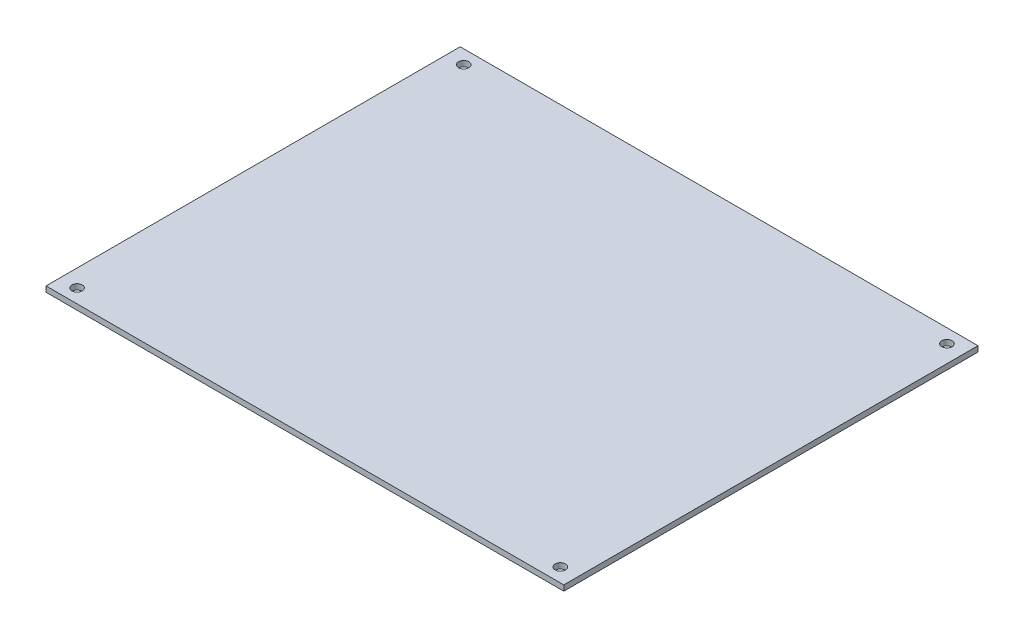
ISO-10303-21;
HEADER;
FILE_DESCRIPTION(('STEP AP214'),'2;1');
FILE_NAME('part.step','',(''),(''),'','','');
FILE_SCHEMA(('AUTOMOTIVE_DESIGN { 1 0 10303 214 1 1 1 1 }'));
ENDSEC;
DATA;
#1=APPLICATION_CONTEXT('core data for automotive mechanical design processes');
#2=APPLICATION_PROTOCOL_DEFINITION('international standard','automotive_design',2000,#1);
#3=PRODUCT_CONTEXT('',#1,'mechanical');
#4=PRODUCT('Part','Part','',(#3));
#5=PRODUCT_RELATED_PRODUCT_CATEGORY('part','',(#4));
#6=PRODUCT_DEFINITION_FORMATION('','',#4);
#7=PRODUCT_DEFINITION_CONTEXT('part definition',#1,'design');
#8=PRODUCT_DEFINITION('design','',#6,#7);
#9=PRODUCT_DEFINITION_SHAPE('','',#8);
#10=(LENGTH_UNIT() NAMED_UNIT(*) SI_UNIT(.MILLI.,.METRE.));
#11=(NAMED_UNIT(*) PLANE_ANGLE_UNIT() SI_UNIT($,.RADIAN.));
#12=(NAMED_UNIT(*) SI_UNIT($,.STERADIAN.) SOLID_ANGLE_UNIT());
#13=UNCERTAINTY_MEASURE_WITH_UNIT(LENGTH_MEASURE(1.E-05),#10,'distance_accuracy_value','');
#14=(GEOMETRIC_REPRESENTATION_CONTEXT(3) GLOBAL_UNCERTAINTY_ASSIGNED_CONTEXT((#13)) GLOBAL_UNIT_ASSIGNED_CONTEXT((#10,
#11,#12)) REPRESENTATION_CONTEXT('',''));
#15=CARTESIAN_POINT('',(0.,0.,0.));
#16=DIRECTION('',(0.,0.,1.));
#17=DIRECTION('',(1.,0.,0.));
#18=AXIS2_PLACEMENT_3D('',#15,#16,#17);
#19=CARTESIAN_POINT('',(0.,1.6,0.));
#20=DIRECTION('',(0.,1.,0.));
#21=DIRECTION('',(0.,0.,1.));
#22=AXIS2_PLACEMENT_3D('',#19,#20,#21);
#23=PLANE('',#22);
#24=CARTESIAN_POINT('',(-70.,1.6,56.));
#25=DIRECTION('',(0.,1.,0.));
#26=DIRECTION('',(0.,0.,-1.));
#27=AXIS2_PLACEMENT_3D('',#24,#25,#26);
#28=CIRCLE('',#27,1.5);
#29=CARTESIAN_POINT('',(-70.,1.6,54.5));
#30=VERTEX_POINT('',#29);
#31=EDGE_CURVE('E123',#30,#30,#28,.T.);
#32=ORIENTED_EDGE('',*,*,#31,.F.);
#33=EDGE_LOOP('',(#32));
#34=FACE_BOUND('',#33,.T.);
#35=CARTESIAN_POINT('',(70.,1.6,-56.));
#36=DIRECTION('',(0.,1.,0.));
#37=DIRECTION('',(0.,0.,1.));
#38=AXIS2_PLACEMENT_3D('',#35,#36,#37);
#39=CIRCLE('',#38,1.5);
#40=CARTESIAN_POINT('',(70.,1.6,-54.5));
#41=VERTEX_POINT('',#40);
#42=EDGE_CURVE('E102',#41,#41,#39,.T.);
#43=ORIENTED_EDGE('',*,*,#42,.F.);
#44=EDGE_LOOP('',(#43));
#45=FACE_BOUND('',#44,.T.);
#46=DIRECTION('',(0.,0.,-1.));
#47=VECTOR('',#46,1.);
#48=CARTESIAN_POINT('',(75.,1.6,-60.));
#49=LINE('',#48,#47);
#50=CARTESIAN_POINT('',(75.,1.6,60.));
#51=VERTEX_POINT('',#50);
#52=CARTESIAN_POINT('',(75.,1.6,-60.));
#53=VERTEX_POINT('',#52);
#54=EDGE_CURVE('E87',#51,#53,#49,.T.);
#55=ORIENTED_EDGE('',*,*,#54,.T.);
#56=DIRECTION('',(-1.,0.,0.));
#57=VECTOR('',#56,1.);
#58=CARTESIAN_POINT('',(-75.,1.6,-60.));
#59=LINE('',#58,#57);
#60=CARTESIAN_POINT('',(-75.,1.6,-60.));
#61=VERTEX_POINT('',#60);
#62=EDGE_CURVE('E82',#53,#61,#59,.T.);
#63=ORIENTED_EDGE('',*,*,#62,.T.);
#64=DIRECTION('',(0.,0.,1.));
#65=VECTOR('',#64,1.);
#66=CARTESIAN_POINT('',(-75.,1.6,-60.));
#67=LINE('',#66,#65);
#68=CARTESIAN_POINT('',(-75.,1.6,60.));
#69=VERTEX_POINT('',#68);
#70=EDGE_CURVE('E85',#61,#69,#67,.T.);
#71=ORIENTED_EDGE('',*,*,#70,.T.);
#72=DIRECTION('',(1.,0.,0.));
#73=VECTOR('',#72,1.);
#74=CARTESIAN_POINT('',(-75.,1.6,60.));
#75=LINE('',#74,#73);
#76=EDGE_CURVE('E52',#69,#51,#75,.T.);
#77=ORIENTED_EDGE('',*,*,#76,.T.);
#78=EDGE_LOOP('',(#55,#63,#71,#77));
#79=FACE_BOUND('',#78,.T.);
#80=CARTESIAN_POINT('',(70.,1.6,56.));
#81=DIRECTION('',(0.,1.,0.));
#82=DIRECTION('',(0.,0.,1.));
#83=AXIS2_PLACEMENT_3D('',#80,#81,#82);
#84=CIRCLE('',#83,1.5);
#85=CARTESIAN_POINT('',(70.,1.6,57.5));
#86=VERTEX_POINT('',#85);
#87=EDGE_CURVE('E117',#86,#86,#84,.T.);
#88=ORIENTED_EDGE('',*,*,#87,.F.);
#89=EDGE_LOOP('',(#88));
#90=FACE_BOUND('',#89,.T.);
#91=CARTESIAN_POINT('',(-70.,1.6,-56.));
#92=DIRECTION('',(0.,1.,0.));
#93=DIRECTION('',(0.,0.,-1.));
#94=AXIS2_PLACEMENT_3D('',#91,#92,#93);
#95=CIRCLE('',#94,1.5);
#96=CARTESIAN_POINT('',(-70.,1.6,-57.5));
#97=VERTEX_POINT('',#96);
#98=EDGE_CURVE('E129',#97,#97,#95,.T.);
#99=ORIENTED_EDGE('',*,*,#98,.F.);
#100=EDGE_LOOP('',(#99));
#101=FACE_BOUND('',#100,.T.);
#102=ADVANCED_FACE('F35',(#34,#45,#79,#90,#101),#23,.T.);
#103=CARTESIAN_POINT('',(0.,0.,0.));
#104=DIRECTION('',(0.,1.,0.));
#105=DIRECTION('',(0.,0.,1.));
#106=AXIS2_PLACEMENT_3D('',#103,#104,#105);
#107=PLANE('',#106);
#108=DIRECTION('',(0.,0.,-1.));
#109=VECTOR('',#108,1.);
#110=CARTESIAN_POINT('',(75.,0.,-60.));
#111=LINE('',#110,#109);
#112=CARTESIAN_POINT('',(75.,0.,60.));
#113=VERTEX_POINT('',#112);
#114=CARTESIAN_POINT('',(75.,0.,-60.));
#115=VERTEX_POINT('',#114);
#116=EDGE_CURVE('E99',#113,#115,#111,.T.);
#117=ORIENTED_EDGE('',*,*,#116,.F.);
#118=DIRECTION('',(1.,0.,0.));
#119=VECTOR('',#118,1.);
#120=CARTESIAN_POINT('',(-75.,0.,60.));
#121=LINE('',#120,#119);
#122=CARTESIAN_POINT('',(-75.,0.,60.));
#123=VERTEX_POINT('',#122);
#124=EDGE_CURVE('E75',#123,#113,#121,.T.);
#125=ORIENTED_EDGE('',*,*,#124,.F.);
#126=DIRECTION('',(0.,0.,1.));
#127=VECTOR('',#126,1.);
#128=CARTESIAN_POINT('',(-75.,0.,-60.));
#129=LINE('',#128,#127);
#130=CARTESIAN_POINT('',(-75.,0.,-60.));
#131=VERTEX_POINT('',#130);
#132=EDGE_CURVE('E69',#131,#123,#129,.T.);
#133=ORIENTED_EDGE('',*,*,#132,.F.);
#134=DIRECTION('',(-1.,0.,0.));
#135=VECTOR('',#134,1.);
#136=CARTESIAN_POINT('',(-75.,0.,-60.));
#137=LINE('',#136,#135);
#138=EDGE_CURVE('E91',#115,#131,#137,.T.);
#139=ORIENTED_EDGE('',*,*,#138,.F.);
#140=EDGE_LOOP('',(#117,#125,#133,#139));
#141=FACE_BOUND('',#140,.T.);
#142=CARTESIAN_POINT('',(70.,0.,-56.));
#143=DIRECTION('',(0.,1.,0.));
#144=DIRECTION('',(0.,0.,1.));
#145=AXIS2_PLACEMENT_3D('',#142,#143,#144);
#146=CIRCLE('',#145,1.5);
#147=CARTESIAN_POINT('',(70.,0.,-54.5));
#148=VERTEX_POINT('',#147);
#149=EDGE_CURVE('E114',#148,#148,#146,.T.);
#150=ORIENTED_EDGE('',*,*,#149,.T.);
#151=EDGE_LOOP('',(#150));
#152=FACE_BOUND('',#151,.T.);
#153=CARTESIAN_POINT('',(70.,0.,56.));
#154=DIRECTION('',(0.,1.,0.));
#155=DIRECTION('',(0.,0.,1.));
#156=AXIS2_PLACEMENT_3D('',#153,#154,#155);
#157=CIRCLE('',#156,1.5);
#158=CARTESIAN_POINT('',(70.,0.,57.5));
#159=VERTEX_POINT('',#158);
#160=EDGE_CURVE('E120',#159,#159,#157,.T.);
#161=ORIENTED_EDGE('',*,*,#160,.T.);
#162=EDGE_LOOP('',(#161));
#163=FACE_BOUND('',#162,.T.);
#164=CARTESIAN_POINT('',(-70.,0.,56.));
#165=DIRECTION('',(0.,1.,0.));
#166=DIRECTION('',(0.,0.,-1.));
#167=AXIS2_PLACEMENT_3D('',#164,#165,#166);
#168=CIRCLE('',#167,1.5);
#169=CARTESIAN_POINT('',(-70.,0.,54.5));
#170=VERTEX_POINT('',#169);
#171=EDGE_CURVE('E126',#170,#170,#168,.T.);
#172=ORIENTED_EDGE('',*,*,#171,.T.);
#173=EDGE_LOOP('',(#172));
#174=FACE_BOUND('',#173,.T.);
#175=CARTESIAN_POINT('',(-70.,0.,-56.));
#176=DIRECTION('',(0.,1.,0.));
#177=DIRECTION('',(0.,0.,-1.));
#178=AXIS2_PLACEMENT_3D('',#175,#176,#177);
#179=CIRCLE('',#178,1.5);
#180=CARTESIAN_POINT('',(-70.,0.,-57.5));
#181=VERTEX_POINT('',#180);
#182=EDGE_CURVE('E132',#181,#181,#179,.T.);
#183=ORIENTED_EDGE('',*,*,#182,.T.);
#184=EDGE_LOOP('',(#183));
#185=FACE_BOUND('',#184,.T.);
#186=ADVANCED_FACE('F110',(#141,#152,#163,#174,#185),#107,.F.);
#187=CARTESIAN_POINT('',(75.,1.6,-60.));
#188=DIRECTION('',(-1.,0.,0.));
#189=DIRECTION('',(0.,0.,1.));
#190=AXIS2_PLACEMENT_3D('',#187,#188,#189);
#191=PLANE('',#190);
#192=ORIENTED_EDGE('',*,*,#116,.T.);
#193=DIRECTION('',(0.,-1.,0.));
#194=VECTOR('',#193,1.);
#195=CARTESIAN_POINT('',(75.,1.6,-60.));
#196=LINE('',#195,#194);
#197=EDGE_CURVE('E11',#53,#115,#196,.T.);
#198=ORIENTED_EDGE('',*,*,#197,.F.);
#199=ORIENTED_EDGE('',*,*,#54,.F.);
#200=DIRECTION('',(0.,-1.,0.));
#201=VECTOR('',#200,1.);
#202=CARTESIAN_POINT('',(75.,1.6,60.));
#203=LINE('',#202,#201);
#204=EDGE_CURVE('E95',#51,#113,#203,.T.);
#205=ORIENTED_EDGE('',*,*,#204,.T.);
#206=EDGE_LOOP('',(#192,#198,#199,#205));
#207=FACE_BOUND('',#206,.T.);
#208=ADVANCED_FACE('F37',(#207),#191,.F.);
#209=CARTESIAN_POINT('',(-75.,1.6,-60.));
#210=DIRECTION('',(0.,0.,1.));
#211=DIRECTION('',(1.,0.,0.));
#212=AXIS2_PLACEMENT_3D('',#209,#210,#211);
#213=PLANE('',#212);
#214=ORIENTED_EDGE('',*,*,#138,.T.);
#215=DIRECTION('',(0.,-1.,0.));
#216=VECTOR('',#215,1.);
#217=CARTESIAN_POINT('',(-75.,1.6,-60.));
#218=LINE('',#217,#216);
#219=EDGE_CURVE('E44',#61,#131,#218,.T.);
#220=ORIENTED_EDGE('',*,*,#219,.F.);
#221=ORIENTED_EDGE('',*,*,#62,.F.);
#222=ORIENTED_EDGE('',*,*,#197,.T.);
#223=EDGE_LOOP('',(#214,#220,#221,#222));
#224=FACE_BOUND('',#223,.T.);
#225=ADVANCED_FACE('F90',(#224),#213,.F.);
#226=CARTESIAN_POINT('',(-75.,1.6,-60.));
#227=DIRECTION('',(1.,0.,0.));
#228=DIRECTION('',(0.,0.,-1.));
#229=AXIS2_PLACEMENT_3D('',#226,#227,#228);
#230=PLANE('',#229);
#231=ORIENTED_EDGE('',*,*,#132,.T.);
#232=DIRECTION('',(0.,-1.,0.));
#233=VECTOR('',#232,1.);
#234=CARTESIAN_POINT('',(-75.,1.6,60.));
#235=LINE('',#234,#233);
#236=EDGE_CURVE('E92',#69,#123,#235,.T.);
#237=ORIENTED_EDGE('',*,*,#236,.F.);
#238=ORIENTED_EDGE('',*,*,#70,.F.);
#239=ORIENTED_EDGE('',*,*,#219,.T.);
#240=EDGE_LOOP('',(#231,#237,#238,#239));
#241=FACE_BOUND('',#240,.T.);
#242=ADVANCED_FACE('F93',(#241),#230,.F.);
#243=CARTESIAN_POINT('',(-75.,1.6,60.));
#244=DIRECTION('',(0.,0.,-1.));
#245=DIRECTION('',(-1.,0.,0.));
#246=AXIS2_PLACEMENT_3D('',#243,#244,#245);
#247=PLANE('',#246);
#248=ORIENTED_EDGE('',*,*,#124,.T.);
#249=ORIENTED_EDGE('',*,*,#204,.F.);
#250=ORIENTED_EDGE('',*,*,#76,.F.);
#251=ORIENTED_EDGE('',*,*,#236,.T.);
#252=EDGE_LOOP('',(#248,#249,#250,#251));
#253=FACE_BOUND('',#252,.T.);
#254=ADVANCED_FACE('F107',(#253),#247,.F.);
#255=CARTESIAN_POINT('',(70.,1.6,-56.));
#256=DIRECTION('',(0.,-1.,0.));
#257=DIRECTION('',(0.,0.,-1.));
#258=AXIS2_PLACEMENT_3D('',#255,#256,#257);
#259=CYLINDRICAL_SURFACE('',#258,1.5);
#260=ORIENTED_EDGE('',*,*,#42,.T.);
#261=EDGE_LOOP('',(#260));
#262=FACE_BOUND('',#261,.T.);
#263=ORIENTED_EDGE('',*,*,#149,.F.);
#264=EDGE_LOOP('',(#263));
#265=FACE_BOUND('',#264,.T.);
#266=ADVANCED_FACE('F151',(#262,#265),#259,.F.);
#267=CARTESIAN_POINT('',(70.,1.6,56.));
#268=DIRECTION('',(0.,-1.,0.));
#269=DIRECTION('',(0.,0.,-1.));
#270=AXIS2_PLACEMENT_3D('',#267,#268,#269);
#271=CYLINDRICAL_SURFACE('',#270,1.5);
#272=ORIENTED_EDGE('',*,*,#87,.T.);
#273=EDGE_LOOP('',(#272));
#274=FACE_BOUND('',#273,.T.);
#275=ORIENTED_EDGE('',*,*,#160,.F.);
#276=EDGE_LOOP('',(#275));
#277=FACE_BOUND('',#276,.T.);
#278=ADVANCED_FACE('F197',(#274,#277),#271,.F.);
#279=CARTESIAN_POINT('',(-70.,1.6,56.));
#280=DIRECTION('',(0.,-1.,0.));
#281=DIRECTION('',(0.,0.,-1.));
#282=AXIS2_PLACEMENT_3D('',#279,#280,#281);
#283=CYLINDRICAL_SURFACE('',#282,1.5);
#284=ORIENTED_EDGE('',*,*,#31,.T.);
#285=EDGE_LOOP('',(#284));
#286=FACE_BOUND('',#285,.T.);
#287=ORIENTED_EDGE('',*,*,#171,.F.);
#288=EDGE_LOOP('',(#287));
#289=FACE_BOUND('',#288,.T.);
#290=ADVANCED_FACE('F205',(#286,#289),#283,.F.);
#291=CARTESIAN_POINT('',(-70.,1.6,-56.));
#292=DIRECTION('',(0.,-1.,0.));
#293=DIRECTION('',(0.,0.,-1.));
#294=AXIS2_PLACEMENT_3D('',#291,#292,#293);
#295=CYLINDRICAL_SURFACE('',#294,1.5);
#296=ORIENTED_EDGE('',*,*,#98,.T.);
#297=EDGE_LOOP('',(#296));
#298=FACE_BOUND('',#297,.T.);
#299=ORIENTED_EDGE('',*,*,#182,.F.);
#300=EDGE_LOOP('',(#299));
#301=FACE_BOUND('',#300,.T.);
#302=ADVANCED_FACE('F138',(#298,#301),#295,.F.);
#303=CLOSED_SHELL('',(#102,#186,#208,#225,#242,#254,#266,#278,#290,#302));
#304=MANIFOLD_SOLID_BREP('B2',#303);
#305=ADVANCED_BREP_SHAPE_REPRESENTATION('',(#18,#304),#14);
#306=SHAPE_DEFINITION_REPRESENTATION(#9,#305);
ENDSEC;
END-ISO-10303-21;
